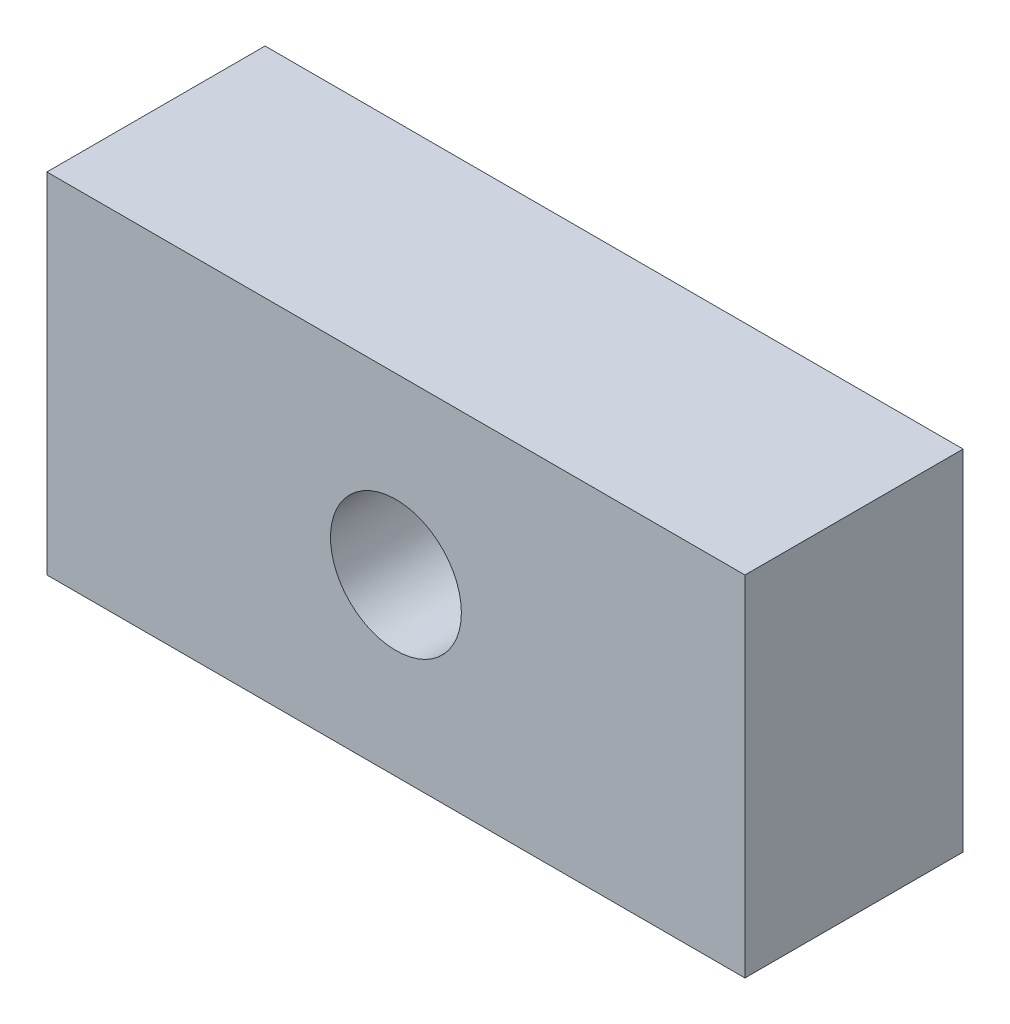
ISO-10303-21;
HEADER;
FILE_DESCRIPTION(('STEP AP214'),'2;1');
FILE_NAME('part.step','',(''),(''),'','','');
FILE_SCHEMA(('AUTOMOTIVE_DESIGN { 1 0 10303 214 1 1 1 1 }'));
ENDSEC;
DATA;
#1=APPLICATION_CONTEXT('core data for automotive mechanical design processes');
#2=APPLICATION_PROTOCOL_DEFINITION('international standard','automotive_design',2000,#1);
#3=PRODUCT_CONTEXT('',#1,'mechanical');
#4=PRODUCT('Part','Part','',(#3));
#5=PRODUCT_RELATED_PRODUCT_CATEGORY('part','',(#4));
#6=PRODUCT_DEFINITION_FORMATION('','',#4);
#7=PRODUCT_DEFINITION_CONTEXT('part definition',#1,'design');
#8=PRODUCT_DEFINITION('design','',#6,#7);
#9=PRODUCT_DEFINITION_SHAPE('','',#8);
#10=(LENGTH_UNIT() NAMED_UNIT(*) SI_UNIT(.MILLI.,.METRE.));
#11=(NAMED_UNIT(*) PLANE_ANGLE_UNIT() SI_UNIT($,.RADIAN.));
#12=(NAMED_UNIT(*) SI_UNIT($,.STERADIAN.) SOLID_ANGLE_UNIT());
#13=UNCERTAINTY_MEASURE_WITH_UNIT(LENGTH_MEASURE(1.E-05),#10,'distance_accuracy_value','');
#14=(GEOMETRIC_REPRESENTATION_CONTEXT(3) GLOBAL_UNCERTAINTY_ASSIGNED_CONTEXT((#13)) GLOBAL_UNIT_ASSIGNED_CONTEXT((#10,
#11,#12)) REPRESENTATION_CONTEXT('',''));
#15=CARTESIAN_POINT('',(0.,0.,0.));
#16=DIRECTION('',(0.,0.,1.));
#17=DIRECTION('',(1.,0.,0.));
#18=AXIS2_PLACEMENT_3D('',#15,#16,#17);
#19=CARTESIAN_POINT('',(0.,0.,31.75));
#20=DIRECTION('',(0.,0.,-1.));
#21=DIRECTION('',(-1.,0.,0.));
#22=AXIS2_PLACEMENT_3D('',#19,#20,#21);
#23=PLANE('',#22);
#24=DIRECTION('',(0.,-1.,0.));
#25=VECTOR('',#24,1.);
#26=CARTESIAN_POINT('',(0.,0.,31.75));
#27=LINE('',#26,#25);
#28=CARTESIAN_POINT('',(0.,50.8,31.75));
#29=VERTEX_POINT('',#28);
#30=CARTESIAN_POINT('',(0.,0.,31.75));
#31=VERTEX_POINT('',#30);
#32=EDGE_CURVE('E91',#29,#31,#27,.T.);
#33=ORIENTED_EDGE('',*,*,#32,.T.);
#34=DIRECTION('',(1.,0.,0.));
#35=VECTOR('',#34,1.);
#36=CARTESIAN_POINT('',(0.,0.,31.75));
#37=LINE('',#36,#35);
#38=CARTESIAN_POINT('',(101.6,0.,31.75));
#39=VERTEX_POINT('',#38);
#40=EDGE_CURVE('E86',#31,#39,#37,.T.);
#41=ORIENTED_EDGE('',*,*,#40,.T.);
#42=DIRECTION('',(0.,1.,0.));
#43=VECTOR('',#42,1.);
#44=CARTESIAN_POINT('',(101.6,0.,31.75));
#45=LINE('',#44,#43);
#46=CARTESIAN_POINT('',(101.6,50.8,31.75));
#47=VERTEX_POINT('',#46);
#48=EDGE_CURVE('E87',#39,#47,#45,.T.);
#49=ORIENTED_EDGE('',*,*,#48,.T.);
#50=DIRECTION('',(-1.,0.,0.));
#51=VECTOR('',#50,1.);
#52=CARTESIAN_POINT('',(0.,50.8,31.75));
#53=LINE('',#52,#51);
#54=EDGE_CURVE('E57',#47,#29,#53,.T.);
#55=ORIENTED_EDGE('',*,*,#54,.T.);
#56=EDGE_LOOP('',(#33,#41,#49,#55));
#57=FACE_BOUND('',#56,.T.);
#58=CARTESIAN_POINT('',(50.8,25.4,31.75));
#59=DIRECTION('',(0.,0.,1.));
#60=DIRECTION('',(1.,0.,0.));
#61=AXIS2_PLACEMENT_3D('',#58,#59,#60);
#62=CIRCLE('',#61,9.525);
#63=CARTESIAN_POINT('',(60.325,25.4,31.75));
#64=VERTEX_POINT('',#63);
#65=EDGE_CURVE('E106',#64,#64,#62,.T.);
#66=ORIENTED_EDGE('',*,*,#65,.F.);
#67=EDGE_LOOP('',(#66));
#68=FACE_BOUND('',#67,.T.);
#69=ADVANCED_FACE('F39',(#57,#68),#23,.F.);
#70=CARTESIAN_POINT('',(0.,0.,0.));
#71=DIRECTION('',(0.,0.,-1.));
#72=DIRECTION('',(-1.,0.,0.));
#73=AXIS2_PLACEMENT_3D('',#70,#71,#72);
#74=PLANE('',#73);
#75=DIRECTION('',(0.,-1.,0.));
#76=VECTOR('',#75,1.);
#77=CARTESIAN_POINT('',(0.,0.,0.));
#78=LINE('',#77,#76);
#79=CARTESIAN_POINT('',(0.,50.8,0.));
#80=VERTEX_POINT('',#79);
#81=CARTESIAN_POINT('',(0.,0.,0.));
#82=VERTEX_POINT('',#81);
#83=EDGE_CURVE('E104',#80,#82,#78,.T.);
#84=ORIENTED_EDGE('',*,*,#83,.F.);
#85=DIRECTION('',(-1.,0.,0.));
#86=VECTOR('',#85,1.);
#87=CARTESIAN_POINT('',(0.,50.8,0.));
#88=LINE('',#87,#86);
#89=CARTESIAN_POINT('',(101.6,50.8,0.));
#90=VERTEX_POINT('',#89);
#91=EDGE_CURVE('E80',#90,#80,#88,.T.);
#92=ORIENTED_EDGE('',*,*,#91,.F.);
#93=DIRECTION('',(0.,1.,0.));
#94=VECTOR('',#93,1.);
#95=CARTESIAN_POINT('',(101.6,0.,0.));
#96=LINE('',#95,#94);
#97=CARTESIAN_POINT('',(101.6,0.,0.));
#98=VERTEX_POINT('',#97);
#99=EDGE_CURVE('E74',#98,#90,#96,.T.);
#100=ORIENTED_EDGE('',*,*,#99,.F.);
#101=DIRECTION('',(1.,0.,0.));
#102=VECTOR('',#101,1.);
#103=CARTESIAN_POINT('',(0.,0.,0.));
#104=LINE('',#103,#102);
#105=EDGE_CURVE('E94',#82,#98,#104,.T.);
#106=ORIENTED_EDGE('',*,*,#105,.F.);
#107=EDGE_LOOP('',(#84,#92,#100,#106));
#108=FACE_BOUND('',#107,.T.);
#109=CARTESIAN_POINT('',(50.8,25.4,0.));
#110=DIRECTION('',(0.,0.,1.));
#111=DIRECTION('',(1.,0.,0.));
#112=AXIS2_PLACEMENT_3D('',#109,#110,#111);
#113=CIRCLE('',#112,9.525);
#114=CARTESIAN_POINT('',(60.325,25.4,0.));
#115=VERTEX_POINT('',#114);
#116=EDGE_CURVE('E119',#115,#115,#113,.T.);
#117=ORIENTED_EDGE('',*,*,#116,.T.);
#118=EDGE_LOOP('',(#117));
#119=FACE_BOUND('',#118,.T.);
#120=ADVANCED_FACE('F114',(#108,#119),#74,.T.);
#121=CARTESIAN_POINT('',(0.,0.,31.75));
#122=DIRECTION('',(1.,0.,0.));
#123=DIRECTION('',(0.,0.,-1.));
#124=AXIS2_PLACEMENT_3D('',#121,#122,#123);
#125=PLANE('',#124);
#126=ORIENTED_EDGE('',*,*,#83,.T.);
#127=DIRECTION('',(0.,0.,-1.));
#128=VECTOR('',#127,1.);
#129=CARTESIAN_POINT('',(0.,0.,31.75));
#130=LINE('',#129,#128);
#131=EDGE_CURVE('E11',#31,#82,#130,.T.);
#132=ORIENTED_EDGE('',*,*,#131,.F.);
#133=ORIENTED_EDGE('',*,*,#32,.F.);
#134=DIRECTION('',(0.,0.,-1.));
#135=VECTOR('',#134,1.);
#136=CARTESIAN_POINT('',(0.,50.8,31.75));
#137=LINE('',#136,#135);
#138=EDGE_CURVE('E98',#29,#80,#137,.T.);
#139=ORIENTED_EDGE('',*,*,#138,.T.);
#140=EDGE_LOOP('',(#126,#132,#133,#139));
#141=FACE_BOUND('',#140,.T.);
#142=ADVANCED_FACE('F41',(#141),#125,.F.);
#143=CARTESIAN_POINT('',(0.,0.,31.75));
#144=DIRECTION('',(0.,1.,0.));
#145=DIRECTION('',(0.,0.,1.));
#146=AXIS2_PLACEMENT_3D('',#143,#144,#145);
#147=PLANE('',#146);
#148=ORIENTED_EDGE('',*,*,#105,.T.);
#149=DIRECTION('',(0.,0.,-1.));
#150=VECTOR('',#149,1.);
#151=CARTESIAN_POINT('',(101.6,0.,31.75));
#152=LINE('',#151,#150);
#153=EDGE_CURVE('E48',#39,#98,#152,.T.);
#154=ORIENTED_EDGE('',*,*,#153,.F.);
#155=ORIENTED_EDGE('',*,*,#40,.F.);
#156=ORIENTED_EDGE('',*,*,#131,.T.);
#157=EDGE_LOOP('',(#148,#154,#155,#156));
#158=FACE_BOUND('',#157,.T.);
#159=ADVANCED_FACE('F92',(#158),#147,.F.);
#160=CARTESIAN_POINT('',(101.6,0.,31.75));
#161=DIRECTION('',(-1.,0.,0.));
#162=DIRECTION('',(0.,0.,1.));
#163=AXIS2_PLACEMENT_3D('',#160,#161,#162);
#164=PLANE('',#163);
#165=ORIENTED_EDGE('',*,*,#99,.T.);
#166=DIRECTION('',(0.,0.,-1.));
#167=VECTOR('',#166,1.);
#168=CARTESIAN_POINT('',(101.6,50.8,31.75));
#169=LINE('',#168,#167);
#170=EDGE_CURVE('E96',#47,#90,#169,.T.);
#171=ORIENTED_EDGE('',*,*,#170,.F.);
#172=ORIENTED_EDGE('',*,*,#48,.F.);
#173=ORIENTED_EDGE('',*,*,#153,.T.);
#174=EDGE_LOOP('',(#165,#171,#172,#173));
#175=FACE_BOUND('',#174,.T.);
#176=ADVANCED_FACE('F100',(#175),#164,.F.);
#177=CARTESIAN_POINT('',(0.,50.8,31.75));
#178=DIRECTION('',(0.,-1.,0.));
#179=DIRECTION('',(0.,0.,-1.));
#180=AXIS2_PLACEMENT_3D('',#177,#178,#179);
#181=PLANE('',#180);
#182=ORIENTED_EDGE('',*,*,#91,.T.);
#183=ORIENTED_EDGE('',*,*,#138,.F.);
#184=ORIENTED_EDGE('',*,*,#54,.F.);
#185=ORIENTED_EDGE('',*,*,#170,.T.);
#186=EDGE_LOOP('',(#182,#183,#184,#185));
#187=FACE_BOUND('',#186,.T.);
#188=ADVANCED_FACE('F112',(#187),#181,.F.);
#189=CARTESIAN_POINT('',(50.8,25.4,31.75));
#190=DIRECTION('',(0.,0.,-1.));
#191=DIRECTION('',(-1.,0.,0.));
#192=AXIS2_PLACEMENT_3D('',#189,#190,#191);
#193=CYLINDRICAL_SURFACE('',#192,9.525);
#194=ORIENTED_EDGE('',*,*,#65,.T.);
#195=EDGE_LOOP('',(#194));
#196=FACE_BOUND('',#195,.T.);
#197=ORIENTED_EDGE('',*,*,#116,.F.);
#198=EDGE_LOOP('',(#197));
#199=FACE_BOUND('',#198,.T.);
#200=ADVANCED_FACE('F125',(#196,#199),#193,.F.);
#201=CLOSED_SHELL('',(#69,#120,#142,#159,#176,#188,#200));
#202=MANIFOLD_SOLID_BREP('B2',#201);
#203=ADVANCED_BREP_SHAPE_REPRESENTATION('',(#18,#202),#14);
#204=SHAPE_DEFINITION_REPRESENTATION(#9,#203);
ENDSEC;
END-ISO-10303-21;
